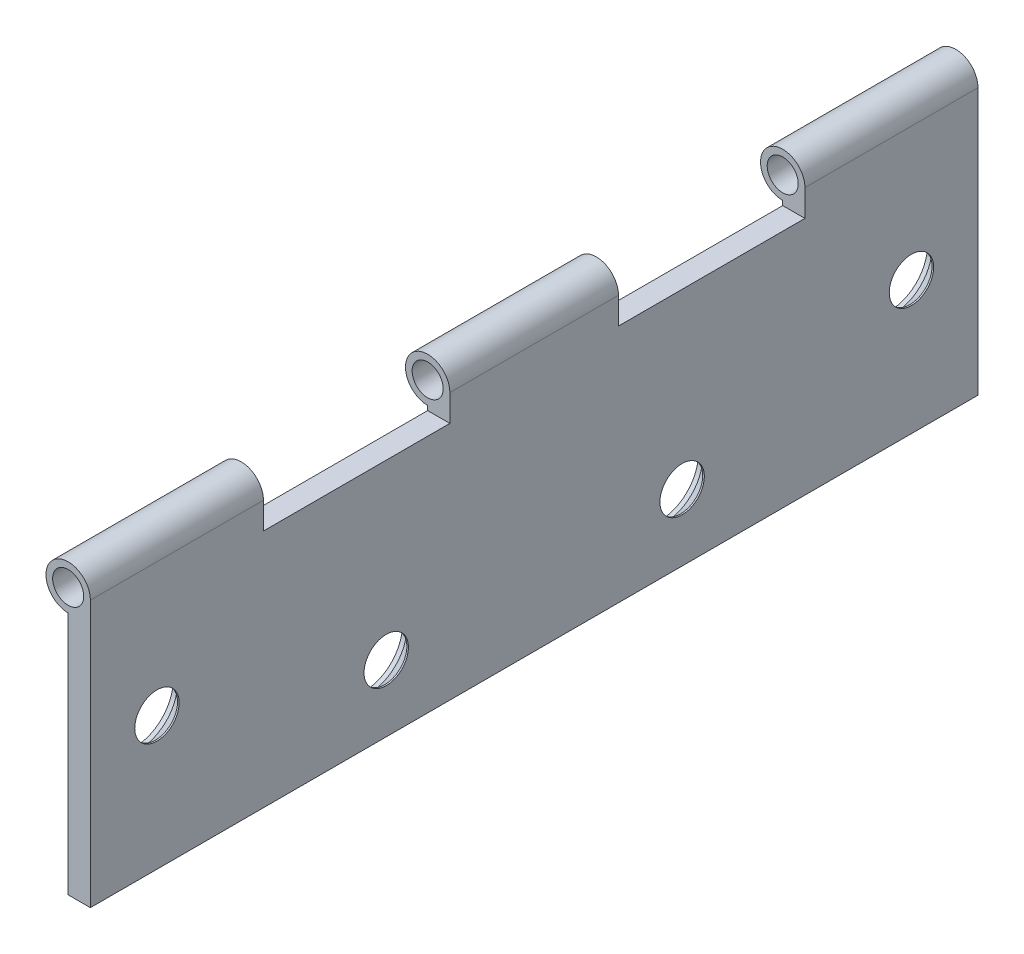
ISO-10303-21;
HEADER;
FILE_DESCRIPTION(('STEP AP214'),'2;1');
FILE_NAME('part.step','',(''),(''),'','','');
FILE_SCHEMA(('AUTOMOTIVE_DESIGN { 1 0 10303 214 1 1 1 1 }'));
ENDSEC;
DATA;
#1=APPLICATION_CONTEXT('core data for automotive mechanical design processes');
#2=APPLICATION_PROTOCOL_DEFINITION('international standard','automotive_design',2000,#1);
#3=PRODUCT_CONTEXT('',#1,'mechanical');
#4=PRODUCT('Part','Part','',(#3));
#5=PRODUCT_RELATED_PRODUCT_CATEGORY('part','',(#4));
#6=PRODUCT_DEFINITION_FORMATION('','',#4);
#7=PRODUCT_DEFINITION_CONTEXT('part definition',#1,'design');
#8=PRODUCT_DEFINITION('design','',#6,#7);
#9=PRODUCT_DEFINITION_SHAPE('','',#8);
#10=(LENGTH_UNIT() NAMED_UNIT(*) SI_UNIT(.MILLI.,.METRE.));
#11=(NAMED_UNIT(*) PLANE_ANGLE_UNIT() SI_UNIT($,.RADIAN.));
#12=(NAMED_UNIT(*) SI_UNIT($,.STERADIAN.) SOLID_ANGLE_UNIT());
#13=UNCERTAINTY_MEASURE_WITH_UNIT(LENGTH_MEASURE(1.E-05),#10,'distance_accuracy_value','');
#14=(GEOMETRIC_REPRESENTATION_CONTEXT(3) GLOBAL_UNCERTAINTY_ASSIGNED_CONTEXT((#13)) GLOBAL_UNIT_ASSIGNED_CONTEXT((#10,
#11,#12)) REPRESENTATION_CONTEXT('',''));
#15=CARTESIAN_POINT('',(0.,0.,0.));
#16=DIRECTION('',(0.,0.,1.));
#17=DIRECTION('',(1.,0.,0.));
#18=AXIS2_PLACEMENT_3D('',#15,#16,#17);
#19=CARTESIAN_POINT('',(-3.33066907387547E-13,60.0000000000005,99.9999999999994));
#20=DIRECTION('',(0.,0.,-1.));
#21=DIRECTION('',(-1.,0.,0.));
#22=AXIS2_PLACEMENT_3D('',#19,#20,#21);
#23=CYLINDRICAL_SURFACE('',#22,5.);
#24=CARTESIAN_POINT('',(-3.33066907387547E-13,60.0000000000007,60.9999999999993));
#25=DIRECTION('',(0.,0.,1.));
#26=DIRECTION('',(1.,0.,0.));
#27=AXIS2_PLACEMENT_3D('',#24,#25,#26);
#28=CIRCLE('',#27,5.);
#29=CARTESIAN_POINT('',(-3.33066907387547E-13,55.0000000000006,60.9999999999993));
#30=VERTEX_POINT('',#29);
#31=CARTESIAN_POINT('',(4.99999999999967,60.0000000000007,60.9999999999993));
#32=VERTEX_POINT('',#31);
#33=EDGE_CURVE('E143',#30,#32,#28,.F.);
#34=ORIENTED_EDGE('',*,*,#33,.F.);
#35=DIRECTION('',(0.,0.,-1.));
#36=VECTOR('',#35,1.);
#37=CARTESIAN_POINT('',(-3.33066907387547E-13,55.0000000000006,99.9999999999994));
#38=LINE('',#37,#36);
#39=CARTESIAN_POINT('',(-3.33066907387547E-13,55.0000000000006,99.9999999999994));
#40=VERTEX_POINT('',#39);
#41=EDGE_CURVE('E231',#30,#40,#38,.F.);
#42=ORIENTED_EDGE('',*,*,#41,.T.);
#43=CARTESIAN_POINT('',(-3.33066907387547E-13,60.0000000000005,99.9999999999994));
#44=DIRECTION('',(0.,0.,-1.));
#45=DIRECTION('',(-1.,0.,0.));
#46=AXIS2_PLACEMENT_3D('',#43,#44,#45);
#47=CIRCLE('',#46,5.);
#48=CARTESIAN_POINT('',(4.99999999999967,60.0000000000005,99.9999999999994));
#49=VERTEX_POINT('',#48);
#50=EDGE_CURVE('E228',#40,#49,#47,.T.);
#51=ORIENTED_EDGE('',*,*,#50,.T.);
#52=DIRECTION('',(0.,0.,-1.));
#53=VECTOR('',#52,1.);
#54=CARTESIAN_POINT('',(4.99999999999967,60.0000000000005,99.9999999999994));
#55=LINE('',#54,#53);
#56=EDGE_CURVE('E117',#49,#32,#55,.T.);
#57=ORIENTED_EDGE('',*,*,#56,.T.);
#58=EDGE_LOOP('',(#34,#42,#51,#57));
#59=FACE_BOUND('',#58,.T.);
#60=ADVANCED_FACE('F48',(#59),#23,.T.);
#61=CARTESIAN_POINT('',(-3.33066907387547E-13,54.9999999999999,-19.0000000000015));
#62=VERTEX_POINT('',#61);
#63=CARTESIAN_POINT('',(-3.33066907387547E-13,55.0000000000006,18.9999999999988));
#64=VERTEX_POINT('',#63);
#65=EDGE_CURVE('E234',#62,#64,#38,.F.);
#66=ORIENTED_EDGE('',*,*,#65,.T.);
#67=CARTESIAN_POINT('',(-3.33066907387547E-13,60.0000000000007,18.9999999999988));
#68=DIRECTION('',(0.,0.,-1.));
#69=DIRECTION('',(-1.,0.,0.));
#70=AXIS2_PLACEMENT_3D('',#67,#68,#69);
#71=CIRCLE('',#70,5.);
#72=CARTESIAN_POINT('',(4.99999999999967,60.0000000000007,18.9999999999988));
#73=VERTEX_POINT('',#72);
#74=EDGE_CURVE('E63',#73,#64,#71,.F.);
#75=ORIENTED_EDGE('',*,*,#74,.F.);
#76=CARTESIAN_POINT('',(4.99999999999967,60.0000000000001,-19.0000000000015));
#77=VERTEX_POINT('',#76);
#78=EDGE_CURVE('E120',#73,#77,#55,.T.);
#79=ORIENTED_EDGE('',*,*,#78,.T.);
#80=CARTESIAN_POINT('',(-3.33066907387547E-13,60.0000000000001,-19.0000000000015));
#81=DIRECTION('',(0.,0.,1.));
#82=DIRECTION('',(1.,0.,0.));
#83=AXIS2_PLACEMENT_3D('',#80,#81,#82);
#84=CIRCLE('',#83,5.);
#85=EDGE_CURVE('E124',#62,#77,#84,.F.);
#86=ORIENTED_EDGE('',*,*,#85,.F.);
#87=EDGE_LOOP('',(#66,#75,#79,#86));
#88=FACE_BOUND('',#87,.T.);
#89=ADVANCED_FACE('F333',(#88),#23,.T.);
#90=CARTESIAN_POINT('',(-3.33066907387547E-13,60.0000000000005,99.9999999999994));
#91=DIRECTION('',(0.,0.,-1.));
#92=DIRECTION('',(-1.,0.,0.));
#93=AXIS2_PLACEMENT_3D('',#90,#91,#92);
#94=CYLINDRICAL_SURFACE('',#93,3.5);
#95=CARTESIAN_POINT('',(-3.33066907387547E-13,60.0000000000007,60.9999999999993));
#96=DIRECTION('',(0.,0.,1.));
#97=DIRECTION('',(1.,0.,0.));
#98=AXIS2_PLACEMENT_3D('',#95,#96,#97);
#99=CIRCLE('',#98,3.5);
#100=CARTESIAN_POINT('',(3.49999999999967,60.0000000000007,60.9999999999993));
#101=VERTEX_POINT('',#100);
#102=EDGE_CURVE('E137',#101,#101,#99,.F.);
#103=ORIENTED_EDGE('',*,*,#102,.T.);
#104=EDGE_LOOP('',(#103));
#105=FACE_BOUND('',#104,.T.);
#106=CARTESIAN_POINT('',(-3.33066907387547E-13,60.0000000000005,99.9999999999994));
#107=DIRECTION('',(0.,0.,-1.));
#108=DIRECTION('',(-1.,0.,0.));
#109=AXIS2_PLACEMENT_3D('',#106,#107,#108);
#110=CIRCLE('',#109,3.5);
#111=CARTESIAN_POINT('',(-3.50000000000033,60.0000000000005,99.9999999999994));
#112=VERTEX_POINT('',#111);
#113=EDGE_CURVE('E223',#112,#112,#110,.T.);
#114=ORIENTED_EDGE('',*,*,#113,.F.);
#115=EDGE_LOOP('',(#114));
#116=FACE_BOUND('',#115,.T.);
#117=ADVANCED_FACE('F346',(#105,#116),#94,.F.);
#118=CARTESIAN_POINT('',(0.,60.0000000000001,-61.0000000000013));
#119=DIRECTION('',(0.,0.,-1.));
#120=DIRECTION('',(-1.,0.,0.));
#121=AXIS2_PLACEMENT_3D('',#118,#119,#120);
#122=CIRCLE('',#121,3.5);
#123=CARTESIAN_POINT('',(-3.5,60.0000000000001,-61.0000000000013));
#124=VERTEX_POINT('',#123);
#125=EDGE_CURVE('E126',#124,#124,#122,.F.);
#126=ORIENTED_EDGE('',*,*,#125,.T.);
#127=EDGE_LOOP('',(#126));
#128=FACE_BOUND('',#127,.T.);
#129=CARTESIAN_POINT('',(0.,60.0000000000001,-100.000000000001));
#130=DIRECTION('',(0.,0.,-1.));
#131=DIRECTION('',(-1.,0.,0.));
#132=AXIS2_PLACEMENT_3D('',#129,#130,#131);
#133=CIRCLE('',#132,3.5);
#134=CARTESIAN_POINT('',(-3.5,60.0000000000001,-100.000000000001));
#135=VERTEX_POINT('',#134);
#136=EDGE_CURVE('E222',#135,#135,#133,.T.);
#137=ORIENTED_EDGE('',*,*,#136,.T.);
#138=EDGE_LOOP('',(#137));
#139=FACE_BOUND('',#138,.T.);
#140=ADVANCED_FACE('F347',(#128,#139),#94,.F.);
#141=CARTESIAN_POINT('',(5.,6.66133814775094E-13,99.9999999999994));
#142=DIRECTION('',(-1.,0.,0.));
#143=DIRECTION('',(0.,0.,1.));
#144=AXIS2_PLACEMENT_3D('',#141,#142,#143);
#145=PLANE('',#144);
#146=DIRECTION('',(0.,0.,1.));
#147=VECTOR('',#146,1.);
#148=CARTESIAN_POINT('',(4.99999999999967,54.0000000000007,18.9999999999988));
#149=LINE('',#148,#147);
#150=CARTESIAN_POINT('',(4.99999999999967,54.0000000000007,18.9999999999988));
#151=VERTEX_POINT('',#150);
#152=CARTESIAN_POINT('',(4.99999999999967,54.0000000000007,60.9999999999993));
#153=VERTEX_POINT('',#152);
#154=EDGE_CURVE('E315',#151,#153,#149,.T.);
#155=ORIENTED_EDGE('',*,*,#154,.T.);
#156=DIRECTION('',(0.,1.,0.));
#157=VECTOR('',#156,1.);
#158=CARTESIAN_POINT('',(4.99999999999967,54.0000000000007,60.9999999999993));
#159=LINE('',#158,#157);
#160=EDGE_CURVE('E322',#153,#32,#159,.T.);
#161=ORIENTED_EDGE('',*,*,#160,.T.);
#162=ORIENTED_EDGE('',*,*,#56,.F.);
#163=DIRECTION('',(0.,1.,0.));
#164=VECTOR('',#163,1.);
#165=CARTESIAN_POINT('',(5.,6.66133814775094E-13,99.9999999999994));
#166=LINE('',#165,#164);
#167=CARTESIAN_POINT('',(5.,6.66133814775094E-13,99.9999999999994));
#168=VERTEX_POINT('',#167);
#169=EDGE_CURVE('E92',#168,#49,#166,.T.);
#170=ORIENTED_EDGE('',*,*,#169,.F.);
#171=DIRECTION('',(0.,0.,-1.));
#172=VECTOR('',#171,1.);
#173=CARTESIAN_POINT('',(5.,6.66133814775094E-13,99.9999999999994));
#174=LINE('',#173,#172);
#175=CARTESIAN_POINT('',(5.,0.,-100.));
#176=VERTEX_POINT('',#175);
#177=EDGE_CURVE('E72',#168,#176,#174,.T.);
#178=ORIENTED_EDGE('',*,*,#177,.T.);
#179=DIRECTION('',(0.,1.,0.));
#180=VECTOR('',#179,1.);
#181=CARTESIAN_POINT('',(5.,0.,-100.));
#182=LINE('',#181,#180);
#183=CARTESIAN_POINT('',(5.,60.0000000000001,-100.000000000001));
#184=VERTEX_POINT('',#183);
#185=EDGE_CURVE('E89',#176,#184,#182,.T.);
#186=ORIENTED_EDGE('',*,*,#185,.T.);
#187=CARTESIAN_POINT('',(5.,60.0000000000001,-61.0000000000013));
#188=VERTEX_POINT('',#187);
#189=EDGE_CURVE('E116',#188,#184,#55,.T.);
#190=ORIENTED_EDGE('',*,*,#189,.F.);
#191=DIRECTION('',(0.,-1.,0.));
#192=VECTOR('',#191,1.);
#193=CARTESIAN_POINT('',(5.,54.,-61.0000000000013));
#194=LINE('',#193,#192);
#195=CARTESIAN_POINT('',(5.,54.,-61.0000000000013));
#196=VERTEX_POINT('',#195);
#197=EDGE_CURVE('E151',#188,#196,#194,.T.);
#198=ORIENTED_EDGE('',*,*,#197,.T.);
#199=DIRECTION('',(0.,0.,1.));
#200=VECTOR('',#199,1.);
#201=CARTESIAN_POINT('',(5.,54.,-61.0000000000013));
#202=LINE('',#201,#200);
#203=CARTESIAN_POINT('',(5.,54.,-19.0000000000015));
#204=VERTEX_POINT('',#203);
#205=EDGE_CURVE('E154',#196,#204,#202,.T.);
#206=ORIENTED_EDGE('',*,*,#205,.T.);
#207=DIRECTION('',(0.,1.,0.));
#208=VECTOR('',#207,1.);
#209=CARTESIAN_POINT('',(5.,54.,-19.0000000000015));
#210=LINE('',#209,#208);
#211=EDGE_CURVE('E157',#204,#77,#210,.T.);
#212=ORIENTED_EDGE('',*,*,#211,.T.);
#213=ORIENTED_EDGE('',*,*,#78,.F.);
#214=DIRECTION('',(0.,-1.,0.));
#215=VECTOR('',#214,1.);
#216=CARTESIAN_POINT('',(4.99999999999967,54.0000000000007,18.9999999999988));
#217=LINE('',#216,#215);
#218=EDGE_CURVE('E312',#73,#151,#217,.T.);
#219=ORIENTED_EDGE('',*,*,#218,.T.);
#220=EDGE_LOOP('',(#155,#161,#162,#170,#178,#186,#190,#198,#206,#212,#213,#219));
#221=FACE_BOUND('',#220,.T.);
#222=CARTESIAN_POINT('',(4.99999999999967,30.0000000000005,84.9999999999993));
#223=DIRECTION('',(-1.,0.,0.));
#224=DIRECTION('',(0.,0.,1.));
#225=AXIS2_PLACEMENT_3D('',#222,#223,#224);
#226=CIRCLE('',#225,5.00000000000002);
#227=CARTESIAN_POINT('',(4.99999999999967,30.0000000000005,89.9999999999993));
#228=VERTEX_POINT('',#227);
#229=EDGE_CURVE('E183',#228,#228,#226,.T.);
#230=ORIENTED_EDGE('',*,*,#229,.T.);
#231=EDGE_LOOP('',(#230));
#232=FACE_BOUND('',#231,.T.);
#233=CARTESIAN_POINT('',(5.,15.0000000000006,33.3333333333332));
#234=DIRECTION('',(-1.,0.,0.));
#235=DIRECTION('',(0.,0.,1.));
#236=AXIS2_PLACEMENT_3D('',#233,#234,#235);
#237=CIRCLE('',#236,5.00000000000001);
#238=CARTESIAN_POINT('',(5.,15.0000000000006,38.3333333333332));
#239=VERTEX_POINT('',#238);
#240=EDGE_CURVE('E195',#239,#239,#237,.T.);
#241=ORIENTED_EDGE('',*,*,#240,.T.);
#242=EDGE_LOOP('',(#241));
#243=FACE_BOUND('',#242,.T.);
#244=CARTESIAN_POINT('',(5.,30.,-85.));
#245=DIRECTION('',(-1.,0.,0.));
#246=DIRECTION('',(0.,0.,1.));
#247=AXIS2_PLACEMENT_3D('',#244,#245,#246);
#248=CIRCLE('',#247,5.00000000000002);
#249=CARTESIAN_POINT('',(5.,30.,-79.9999999999999));
#250=VERTEX_POINT('',#249);
#251=EDGE_CURVE('E207',#250,#250,#248,.T.);
#252=ORIENTED_EDGE('',*,*,#251,.T.);
#253=EDGE_LOOP('',(#252));
#254=FACE_BOUND('',#253,.T.);
#255=CARTESIAN_POINT('',(5.,15.0000000000001,-33.3333333333332));
#256=DIRECTION('',(-1.,0.,0.));
#257=DIRECTION('',(0.,0.,1.));
#258=AXIS2_PLACEMENT_3D('',#255,#256,#257);
#259=CIRCLE('',#258,5.00000000000001);
#260=CARTESIAN_POINT('',(5.,15.0000000000001,-28.3333333333332));
#261=VERTEX_POINT('',#260);
#262=EDGE_CURVE('E219',#261,#261,#259,.T.);
#263=ORIENTED_EDGE('',*,*,#262,.T.);
#264=EDGE_LOOP('',(#263));
#265=FACE_BOUND('',#264,.T.);
#266=ADVANCED_FACE('F50',(#221,#232,#243,#254,#265),#145,.F.);
#267=CARTESIAN_POINT('',(0.,6.66133814775094E-13,99.9999999999994));
#268=DIRECTION('',(-1.,0.,0.));
#269=DIRECTION('',(0.,0.,1.));
#270=AXIS2_PLACEMENT_3D('',#267,#268,#269);
#271=PLANE('',#270);
#272=DIRECTION('',(0.,1.,0.));
#273=VECTOR('',#272,1.);
#274=CARTESIAN_POINT('',(0.,6.66133814775094E-13,60.9999999999993));
#275=LINE('',#274,#273);
#276=CARTESIAN_POINT('',(-3.33066907387547E-13,54.0000000000007,60.9999999999993));
#277=VERTEX_POINT('',#276);
#278=EDGE_CURVE('E139',#277,#30,#275,.T.);
#279=ORIENTED_EDGE('',*,*,#278,.F.);
#280=DIRECTION('',(0.,0.,1.));
#281=VECTOR('',#280,1.);
#282=CARTESIAN_POINT('',(-3.33066907387547E-13,54.0000000000005,99.9999999999994));
#283=LINE('',#282,#281);
#284=CARTESIAN_POINT('',(-3.33066907387547E-13,54.0000000000007,18.9999999999988));
#285=VERTEX_POINT('',#284);
#286=EDGE_CURVE('E13',#285,#277,#283,.T.);
#287=ORIENTED_EDGE('',*,*,#286,.F.);
#288=DIRECTION('',(0.,-1.,0.));
#289=VECTOR('',#288,1.);
#290=CARTESIAN_POINT('',(0.,6.66133814775094E-13,19.0000000000001));
#291=LINE('',#290,#289);
#292=EDGE_CURVE('E135',#64,#285,#291,.T.);
#293=ORIENTED_EDGE('',*,*,#292,.F.);
#294=ORIENTED_EDGE('',*,*,#65,.F.);
#295=DIRECTION('',(0.,1.,0.));
#296=VECTOR('',#295,1.);
#297=CARTESIAN_POINT('',(0.,0.,-19.0000000000001));
#298=LINE('',#297,#296);
#299=CARTESIAN_POINT('',(0.,54.,-19.0000000000015));
#300=VERTEX_POINT('',#299);
#301=EDGE_CURVE('E130',#300,#62,#298,.T.);
#302=ORIENTED_EDGE('',*,*,#301,.F.);
#303=DIRECTION('',(0.,0.,1.));
#304=VECTOR('',#303,1.);
#305=CARTESIAN_POINT('',(-3.33066907387547E-13,54.0000000000007,99.9999999999994));
#306=LINE('',#305,#304);
#307=CARTESIAN_POINT('',(0.,54.,-61.0000000000013));
#308=VERTEX_POINT('',#307);
#309=EDGE_CURVE('E56',#308,#300,#306,.T.);
#310=ORIENTED_EDGE('',*,*,#309,.F.);
#311=DIRECTION('',(0.,-1.,0.));
#312=VECTOR('',#311,1.);
#313=CARTESIAN_POINT('',(0.,0.,-60.9999999999999));
#314=LINE('',#313,#312);
#315=CARTESIAN_POINT('',(0.,55.0000000000002,-61.0000000000013));
#316=VERTEX_POINT('',#315);
#317=EDGE_CURVE('E171',#316,#308,#314,.T.);
#318=ORIENTED_EDGE('',*,*,#317,.F.);
#319=CARTESIAN_POINT('',(0.,55.0000000000002,-100.000000000001));
#320=VERTEX_POINT('',#319);
#321=EDGE_CURVE('E106',#320,#316,#38,.F.);
#322=ORIENTED_EDGE('',*,*,#321,.F.);
#323=DIRECTION('',(0.,1.,0.));
#324=VECTOR('',#323,1.);
#325=CARTESIAN_POINT('',(0.,0.,-100.));
#326=LINE('',#325,#324);
#327=CARTESIAN_POINT('',(0.,0.,-100.));
#328=VERTEX_POINT('',#327);
#329=EDGE_CURVE('E105',#328,#320,#326,.T.);
#330=ORIENTED_EDGE('',*,*,#329,.F.);
#331=DIRECTION('',(0.,0.,-1.));
#332=VECTOR('',#331,1.);
#333=CARTESIAN_POINT('',(0.,6.66133814775094E-13,99.9999999999994));
#334=LINE('',#333,#332);
#335=CARTESIAN_POINT('',(0.,6.66133814775094E-13,99.9999999999994));
#336=VERTEX_POINT('',#335);
#337=EDGE_CURVE('E94',#336,#328,#334,.T.);
#338=ORIENTED_EDGE('',*,*,#337,.F.);
#339=DIRECTION('',(0.,1.,0.));
#340=VECTOR('',#339,1.);
#341=CARTESIAN_POINT('',(0.,6.66133814775094E-13,99.9999999999994));
#342=LINE('',#341,#340);
#343=EDGE_CURVE('E111',#336,#40,#342,.T.);
#344=ORIENTED_EDGE('',*,*,#343,.T.);
#345=ORIENTED_EDGE('',*,*,#41,.F.);
#346=EDGE_LOOP('',(#279,#287,#293,#294,#302,#310,#318,#322,#330,#338,#344,#345));
#347=FACE_BOUND('',#346,.T.);
#348=CARTESIAN_POINT('',(-3.33066907387547E-13,30.0000000000005,84.9999999999993));
#349=DIRECTION('',(-1.,0.,0.));
#350=DIRECTION('',(0.,0.,1.));
#351=AXIS2_PLACEMENT_3D('',#348,#349,#350);
#352=CIRCLE('',#351,8.65);
#353=CARTESIAN_POINT('',(-3.36128000433256E-13,30.0000000000005,93.6499999999993));
#354=VERTEX_POINT('',#353);
#355=EDGE_CURVE('E174',#354,#354,#352,.T.);
#356=ORIENTED_EDGE('',*,*,#355,.F.);
#357=EDGE_LOOP('',(#356));
#358=FACE_BOUND('',#357,.T.);
#359=CARTESIAN_POINT('',(0.,15.0000000000006,33.3333333333332));
#360=DIRECTION('',(-1.,0.,0.));
#361=DIRECTION('',(0.,0.,1.));
#362=AXIS2_PLACEMENT_3D('',#359,#360,#361);
#363=CIRCLE('',#362,8.65);
#364=CARTESIAN_POINT('',(0.,15.0000000000006,41.9833333333332));
#365=VERTEX_POINT('',#364);
#366=EDGE_CURVE('E186',#365,#365,#363,.T.);
#367=ORIENTED_EDGE('',*,*,#366,.F.);
#368=EDGE_LOOP('',(#367));
#369=FACE_BOUND('',#368,.T.);
#370=CARTESIAN_POINT('',(0.,30.,-85.));
#371=DIRECTION('',(-1.,0.,0.));
#372=DIRECTION('',(0.,0.,1.));
#373=AXIS2_PLACEMENT_3D('',#370,#371,#372);
#374=CIRCLE('',#373,8.65);
#375=CARTESIAN_POINT('',(0.,30.,-76.35));
#376=VERTEX_POINT('',#375);
#377=EDGE_CURVE('E198',#376,#376,#374,.T.);
#378=ORIENTED_EDGE('',*,*,#377,.F.);
#379=EDGE_LOOP('',(#378));
#380=FACE_BOUND('',#379,.T.);
#381=CARTESIAN_POINT('',(0.,15.0000000000001,-33.3333333333332));
#382=DIRECTION('',(-1.,0.,0.));
#383=DIRECTION('',(0.,0.,1.));
#384=AXIS2_PLACEMENT_3D('',#381,#382,#383);
#385=CIRCLE('',#384,8.65);
#386=CARTESIAN_POINT('',(0.,15.0000000000001,-24.6833333333332));
#387=VERTEX_POINT('',#386);
#388=EDGE_CURVE('E210',#387,#387,#385,.T.);
#389=ORIENTED_EDGE('',*,*,#388,.F.);
#390=EDGE_LOOP('',(#389));
#391=FACE_BOUND('',#390,.T.);
#392=ADVANCED_FACE('F247',(#347,#358,#369,#380,#391),#271,.T.);
#393=CARTESIAN_POINT('',(5.,6.66133814775094E-13,99.9999999999994));
#394=DIRECTION('',(0.,-1.,0.));
#395=DIRECTION('',(0.,0.,-1.));
#396=AXIS2_PLACEMENT_3D('',#393,#394,#395);
#397=PLANE('',#396);
#398=DIRECTION('',(-1.,0.,0.));
#399=VECTOR('',#398,1.);
#400=CARTESIAN_POINT('',(5.,0.,-100.));
#401=LINE('',#400,#399);
#402=EDGE_CURVE('E102',#176,#328,#401,.T.);
#403=ORIENTED_EDGE('',*,*,#402,.F.);
#404=ORIENTED_EDGE('',*,*,#177,.F.);
#405=DIRECTION('',(-1.,0.,0.));
#406=VECTOR('',#405,1.);
#407=CARTESIAN_POINT('',(5.,6.66133814775094E-13,99.9999999999994));
#408=LINE('',#407,#406);
#409=EDGE_CURVE('E95',#168,#336,#408,.T.);
#410=ORIENTED_EDGE('',*,*,#409,.T.);
#411=ORIENTED_EDGE('',*,*,#337,.T.);
#412=EDGE_LOOP('',(#403,#404,#410,#411));
#413=FACE_BOUND('',#412,.T.);
#414=ADVANCED_FACE('F108',(#413),#397,.T.);
#415=CARTESIAN_POINT('',(0.,6.66133814775094E-13,99.9999999999994));
#416=DIRECTION('',(0.,0.,-1.));
#417=DIRECTION('',(-1.,0.,0.));
#418=AXIS2_PLACEMENT_3D('',#415,#416,#417);
#419=PLANE('',#418);
#420=ORIENTED_EDGE('',*,*,#113,.T.);
#421=EDGE_LOOP('',(#420));
#422=FACE_BOUND('',#421,.T.);
#423=ORIENTED_EDGE('',*,*,#169,.T.);
#424=ORIENTED_EDGE('',*,*,#50,.F.);
#425=ORIENTED_EDGE('',*,*,#343,.F.);
#426=ORIENTED_EDGE('',*,*,#409,.F.);
#427=EDGE_LOOP('',(#423,#424,#425,#426));
#428=FACE_BOUND('',#427,.T.);
#429=ADVANCED_FACE('F240',(#422,#428),#419,.F.);
#430=CARTESIAN_POINT('',(0.,0.,-100.));
#431=DIRECTION('',(0.,0.,-1.));
#432=DIRECTION('',(-1.,0.,0.));
#433=AXIS2_PLACEMENT_3D('',#430,#431,#432);
#434=PLANE('',#433);
#435=ORIENTED_EDGE('',*,*,#136,.F.);
#436=EDGE_LOOP('',(#435));
#437=FACE_BOUND('',#436,.T.);
#438=CARTESIAN_POINT('',(0.,60.0000000000001,-100.000000000001));
#439=DIRECTION('',(0.,0.,-1.));
#440=DIRECTION('',(-1.,0.,0.));
#441=AXIS2_PLACEMENT_3D('',#438,#439,#440);
#442=CIRCLE('',#441,5.);
#443=EDGE_CURVE('E104',#320,#184,#442,.T.);
#444=ORIENTED_EDGE('',*,*,#443,.T.);
#445=ORIENTED_EDGE('',*,*,#185,.F.);
#446=ORIENTED_EDGE('',*,*,#402,.T.);
#447=ORIENTED_EDGE('',*,*,#329,.T.);
#448=EDGE_LOOP('',(#444,#445,#446,#447));
#449=FACE_BOUND('',#448,.T.);
#450=ADVANCED_FACE('F100',(#437,#449),#434,.T.);
#451=CARTESIAN_POINT('',(0.,60.0000000000001,-61.0000000000013));
#452=DIRECTION('',(0.,0.,-1.));
#453=DIRECTION('',(-1.,0.,0.));
#454=AXIS2_PLACEMENT_3D('',#451,#452,#453);
#455=CIRCLE('',#454,5.);
#456=EDGE_CURVE('E129',#188,#316,#455,.F.);
#457=ORIENTED_EDGE('',*,*,#456,.F.);
#458=ORIENTED_EDGE('',*,*,#189,.T.);
#459=ORIENTED_EDGE('',*,*,#443,.F.);
#460=ORIENTED_EDGE('',*,*,#321,.T.);
#461=EDGE_LOOP('',(#457,#458,#459,#460));
#462=FACE_BOUND('',#461,.T.);
#463=ADVANCED_FACE('F262',(#462),#23,.T.);
#464=CARTESIAN_POINT('',(-3.33066907387547E-13,60.0000000000007,18.9999999999988));
#465=DIRECTION('',(0.,0.,-1.));
#466=DIRECTION('',(-1.,0.,0.));
#467=AXIS2_PLACEMENT_3D('',#464,#465,#466);
#468=CIRCLE('',#467,3.5);
#469=CARTESIAN_POINT('',(-3.50000000000033,60.0000000000007,18.9999999999988));
#470=VERTEX_POINT('',#469);
#471=EDGE_CURVE('E133',#470,#470,#468,.F.);
#472=ORIENTED_EDGE('',*,*,#471,.T.);
#473=EDGE_LOOP('',(#472));
#474=FACE_BOUND('',#473,.T.);
#475=CARTESIAN_POINT('',(-3.33066907387547E-13,60.0000000000001,-19.0000000000015));
#476=DIRECTION('',(0.,0.,1.));
#477=DIRECTION('',(1.,0.,0.));
#478=AXIS2_PLACEMENT_3D('',#475,#476,#477);
#479=CIRCLE('',#478,3.5);
#480=CARTESIAN_POINT('',(3.49999999999967,60.0000000000001,-19.0000000000015));
#481=VERTEX_POINT('',#480);
#482=EDGE_CURVE('E121',#481,#481,#479,.F.);
#483=ORIENTED_EDGE('',*,*,#482,.T.);
#484=EDGE_LOOP('',(#483));
#485=FACE_BOUND('',#484,.T.);
#486=ADVANCED_FACE('F341',(#474,#485),#94,.F.);
#487=CARTESIAN_POINT('',(0.,15.0000000000001,-33.3333333333332));
#488=DIRECTION('',(-1.,0.,0.));
#489=DIRECTION('',(0.,0.,1.));
#490=AXIS2_PLACEMENT_3D('',#487,#488,#489);
#491=CYLINDRICAL_SURFACE('',#490,5.);
#492=ORIENTED_EDGE('',*,*,#262,.F.);
#493=EDGE_LOOP('',(#492));
#494=FACE_BOUND('',#493,.T.);
#495=CARTESIAN_POINT('',(4.65000000000004,15.0000000000001,-33.3333333333332));
#496=DIRECTION('',(-1.,0.,0.));
#497=DIRECTION('',(0.,0.,1.));
#498=AXIS2_PLACEMENT_3D('',#495,#496,#497);
#499=CIRCLE('',#498,5.);
#500=CARTESIAN_POINT('',(4.65000000000004,15.0000000000001,-28.3333333333332));
#501=VERTEX_POINT('',#500);
#502=EDGE_CURVE('E216',#501,#501,#499,.T.);
#503=ORIENTED_EDGE('',*,*,#502,.T.);
#504=EDGE_LOOP('',(#503));
#505=FACE_BOUND('',#504,.T.);
#506=ADVANCED_FACE('F343',(#494,#505),#491,.F.);
#507=CARTESIAN_POINT('',(1.,15.0000000000001,-33.3333333333332));
#508=DIRECTION('',(-1.,0.,0.));
#509=DIRECTION('',(0.,0.,1.));
#510=AXIS2_PLACEMENT_3D('',#507,#508,#509);
#511=CONICAL_SURFACE('',#510,8.65,0.785398163397449);
#512=ORIENTED_EDGE('',*,*,#502,.F.);
#513=EDGE_LOOP('',(#512));
#514=FACE_BOUND('',#513,.T.);
#515=CARTESIAN_POINT('',(1.,15.0000000000001,-33.3333333333332));
#516=DIRECTION('',(-1.,0.,0.));
#517=DIRECTION('',(0.,0.,1.));
#518=AXIS2_PLACEMENT_3D('',#515,#516,#517);
#519=CIRCLE('',#518,8.65);
#520=CARTESIAN_POINT('',(0.999999999999998,15.0000000000001,-24.6833333333332));
#521=VERTEX_POINT('',#520);
#522=EDGE_CURVE('E213',#521,#521,#519,.T.);
#523=ORIENTED_EDGE('',*,*,#522,.T.);
#524=EDGE_LOOP('',(#523));
#525=FACE_BOUND('',#524,.T.);
#526=ADVANCED_FACE('F352',(#514,#525),#511,.F.);
#527=CARTESIAN_POINT('',(0.,15.0000000000001,-33.3333333333332));
#528=DIRECTION('',(-1.,0.,0.));
#529=DIRECTION('',(0.,0.,1.));
#530=AXIS2_PLACEMENT_3D('',#527,#528,#529);
#531=CYLINDRICAL_SURFACE('',#530,8.65);
#532=ORIENTED_EDGE('',*,*,#522,.F.);
#533=EDGE_LOOP('',(#532));
#534=FACE_BOUND('',#533,.T.);
#535=ORIENTED_EDGE('',*,*,#388,.T.);
#536=EDGE_LOOP('',(#535));
#537=FACE_BOUND('',#536,.T.);
#538=ADVANCED_FACE('F465',(#534,#537),#531,.F.);
#539=CARTESIAN_POINT('',(0.,30.,-85.));
#540=DIRECTION('',(-1.,0.,0.));
#541=DIRECTION('',(0.,0.,1.));
#542=AXIS2_PLACEMENT_3D('',#539,#540,#541);
#543=CYLINDRICAL_SURFACE('',#542,5.00000000000001);
#544=ORIENTED_EDGE('',*,*,#251,.F.);
#545=EDGE_LOOP('',(#544));
#546=FACE_BOUND('',#545,.T.);
#547=CARTESIAN_POINT('',(4.65000000000004,30.,-85.));
#548=DIRECTION('',(-1.,0.,0.));
#549=DIRECTION('',(0.,0.,1.));
#550=AXIS2_PLACEMENT_3D('',#547,#548,#549);
#551=CIRCLE('',#550,5.);
#552=CARTESIAN_POINT('',(4.65000000000004,30.,-80.));
#553=VERTEX_POINT('',#552);
#554=EDGE_CURVE('E204',#553,#553,#551,.T.);
#555=ORIENTED_EDGE('',*,*,#554,.T.);
#556=EDGE_LOOP('',(#555));
#557=FACE_BOUND('',#556,.T.);
#558=ADVANCED_FACE('F461',(#546,#557),#543,.F.);
#559=CARTESIAN_POINT('',(1.,30.,-85.));
#560=DIRECTION('',(-1.,0.,0.));
#561=DIRECTION('',(0.,0.,1.));
#562=AXIS2_PLACEMENT_3D('',#559,#560,#561);
#563=CONICAL_SURFACE('',#562,8.65,0.785398163397449);
#564=ORIENTED_EDGE('',*,*,#554,.F.);
#565=EDGE_LOOP('',(#564));
#566=FACE_BOUND('',#565,.T.);
#567=CARTESIAN_POINT('',(1.,30.,-85.));
#568=DIRECTION('',(-1.,0.,0.));
#569=DIRECTION('',(0.,0.,1.));
#570=AXIS2_PLACEMENT_3D('',#567,#568,#569);
#571=CIRCLE('',#570,8.65);
#572=CARTESIAN_POINT('',(0.999999999999998,30.,-76.35));
#573=VERTEX_POINT('',#572);
#574=EDGE_CURVE('E201',#573,#573,#571,.T.);
#575=ORIENTED_EDGE('',*,*,#574,.T.);
#576=EDGE_LOOP('',(#575));
#577=FACE_BOUND('',#576,.T.);
#578=ADVANCED_FACE('F457',(#566,#577),#563,.F.);
#579=CARTESIAN_POINT('',(0.,30.,-85.));
#580=DIRECTION('',(-1.,0.,0.));
#581=DIRECTION('',(0.,0.,1.));
#582=AXIS2_PLACEMENT_3D('',#579,#580,#581);
#583=CYLINDRICAL_SURFACE('',#582,8.65);
#584=ORIENTED_EDGE('',*,*,#574,.F.);
#585=EDGE_LOOP('',(#584));
#586=FACE_BOUND('',#585,.T.);
#587=ORIENTED_EDGE('',*,*,#377,.T.);
#588=EDGE_LOOP('',(#587));
#589=FACE_BOUND('',#588,.T.);
#590=ADVANCED_FACE('F453',(#586,#589),#583,.F.);
#591=CARTESIAN_POINT('',(0.,15.0000000000006,33.3333333333332));
#592=DIRECTION('',(-1.,0.,0.));
#593=DIRECTION('',(0.,0.,1.));
#594=AXIS2_PLACEMENT_3D('',#591,#592,#593);
#595=CYLINDRICAL_SURFACE('',#594,5.);
#596=ORIENTED_EDGE('',*,*,#240,.F.);
#597=EDGE_LOOP('',(#596));
#598=FACE_BOUND('',#597,.T.);
#599=CARTESIAN_POINT('',(4.65000000000004,15.0000000000006,33.3333333333332));
#600=DIRECTION('',(-1.,0.,0.));
#601=DIRECTION('',(0.,0.,1.));
#602=AXIS2_PLACEMENT_3D('',#599,#600,#601);
#603=CIRCLE('',#602,5.);
#604=CARTESIAN_POINT('',(4.65000000000004,15.0000000000006,38.3333333333332));
#605=VERTEX_POINT('',#604);
#606=EDGE_CURVE('E192',#605,#605,#603,.T.);
#607=ORIENTED_EDGE('',*,*,#606,.T.);
#608=EDGE_LOOP('',(#607));
#609=FACE_BOUND('',#608,.T.);
#610=ADVANCED_FACE('F449',(#598,#609),#595,.F.);
#611=CARTESIAN_POINT('',(1.,15.0000000000006,33.3333333333332));
#612=DIRECTION('',(-1.,0.,0.));
#613=DIRECTION('',(0.,0.,1.));
#614=AXIS2_PLACEMENT_3D('',#611,#612,#613);
#615=CONICAL_SURFACE('',#614,8.65,0.785398163397449);
#616=ORIENTED_EDGE('',*,*,#606,.F.);
#617=EDGE_LOOP('',(#616));
#618=FACE_BOUND('',#617,.T.);
#619=CARTESIAN_POINT('',(1.,15.0000000000006,33.3333333333332));
#620=DIRECTION('',(-1.,0.,0.));
#621=DIRECTION('',(0.,0.,1.));
#622=AXIS2_PLACEMENT_3D('',#619,#620,#621);
#623=CIRCLE('',#622,8.65);
#624=CARTESIAN_POINT('',(0.999999999999998,15.0000000000006,41.9833333333332));
#625=VERTEX_POINT('',#624);
#626=EDGE_CURVE('E189',#625,#625,#623,.T.);
#627=ORIENTED_EDGE('',*,*,#626,.T.);
#628=EDGE_LOOP('',(#627));
#629=FACE_BOUND('',#628,.T.);
#630=ADVANCED_FACE('F445',(#618,#629),#615,.F.);
#631=CARTESIAN_POINT('',(0.,15.0000000000006,33.3333333333332));
#632=DIRECTION('',(-1.,0.,0.));
#633=DIRECTION('',(0.,0.,1.));
#634=AXIS2_PLACEMENT_3D('',#631,#632,#633);
#635=CYLINDRICAL_SURFACE('',#634,8.65);
#636=ORIENTED_EDGE('',*,*,#626,.F.);
#637=EDGE_LOOP('',(#636));
#638=FACE_BOUND('',#637,.T.);
#639=ORIENTED_EDGE('',*,*,#366,.T.);
#640=EDGE_LOOP('',(#639));
#641=FACE_BOUND('',#640,.T.);
#642=ADVANCED_FACE('F441',(#638,#641),#635,.F.);
#643=CARTESIAN_POINT('',(-3.33066907387547E-13,30.0000000000005,84.9999999999993));
#644=DIRECTION('',(-1.,0.,0.));
#645=DIRECTION('',(0.,0.,1.));
#646=AXIS2_PLACEMENT_3D('',#643,#644,#645);
#647=CYLINDRICAL_SURFACE('',#646,5.00000000000001);
#648=ORIENTED_EDGE('',*,*,#229,.F.);
#649=EDGE_LOOP('',(#648));
#650=FACE_BOUND('',#649,.T.);
#651=CARTESIAN_POINT('',(4.64999999999971,30.0000000000005,84.9999999999993));
#652=DIRECTION('',(-1.,0.,0.));
#653=DIRECTION('',(0.,0.,1.));
#654=AXIS2_PLACEMENT_3D('',#651,#652,#653);
#655=CIRCLE('',#654,5.);
#656=CARTESIAN_POINT('',(4.64999999999971,30.0000000000005,89.9999999999993));
#657=VERTEX_POINT('',#656);
#658=EDGE_CURVE('E180',#657,#657,#655,.T.);
#659=ORIENTED_EDGE('',*,*,#658,.T.);
#660=EDGE_LOOP('',(#659));
#661=FACE_BOUND('',#660,.T.);
#662=ADVANCED_FACE('F437',(#650,#661),#647,.F.);
#663=CARTESIAN_POINT('',(0.999999999999668,30.0000000000005,84.9999999999993));
#664=DIRECTION('',(-1.,0.,0.));
#665=DIRECTION('',(0.,0.,1.));
#666=AXIS2_PLACEMENT_3D('',#663,#664,#665);
#667=CONICAL_SURFACE('',#666,8.65,0.785398163397449);
#668=ORIENTED_EDGE('',*,*,#658,.F.);
#669=EDGE_LOOP('',(#668));
#670=FACE_BOUND('',#669,.T.);
#671=CARTESIAN_POINT('',(0.999999999999668,30.0000000000005,84.9999999999993));
#672=DIRECTION('',(-1.,0.,0.));
#673=DIRECTION('',(0.,0.,1.));
#674=AXIS2_PLACEMENT_3D('',#671,#672,#673);
#675=CIRCLE('',#674,8.65);
#676=CARTESIAN_POINT('',(0.999999999999665,30.0000000000005,93.6499999999993));
#677=VERTEX_POINT('',#676);
#678=EDGE_CURVE('E177',#677,#677,#675,.T.);
#679=ORIENTED_EDGE('',*,*,#678,.T.);
#680=EDGE_LOOP('',(#679));
#681=FACE_BOUND('',#680,.T.);
#682=ADVANCED_FACE('F433',(#670,#681),#667,.F.);
#683=CARTESIAN_POINT('',(-3.33066907387547E-13,30.0000000000005,84.9999999999993));
#684=DIRECTION('',(-1.,0.,0.));
#685=DIRECTION('',(0.,0.,1.));
#686=AXIS2_PLACEMENT_3D('',#683,#684,#685);
#687=CYLINDRICAL_SURFACE('',#686,8.65);
#688=ORIENTED_EDGE('',*,*,#678,.F.);
#689=EDGE_LOOP('',(#688));
#690=FACE_BOUND('',#689,.T.);
#691=ORIENTED_EDGE('',*,*,#355,.T.);
#692=EDGE_LOOP('',(#691));
#693=FACE_BOUND('',#692,.T.);
#694=ADVANCED_FACE('F400',(#690,#693),#687,.F.);
#695=CARTESIAN_POINT('',(5.,54.,-61.0000000000013));
#696=DIRECTION('',(0.,0.,-1.));
#697=DIRECTION('',(-1.,0.,0.));
#698=AXIS2_PLACEMENT_3D('',#695,#696,#697);
#699=PLANE('',#698);
#700=ORIENTED_EDGE('',*,*,#317,.T.);
#701=DIRECTION('',(-1.,0.,0.));
#702=VECTOR('',#701,1.);
#703=CARTESIAN_POINT('',(5.,54.,-61.0000000000013));
#704=LINE('',#703,#702);
#705=EDGE_CURVE('E160',#196,#308,#704,.T.);
#706=ORIENTED_EDGE('',*,*,#705,.F.);
#707=ORIENTED_EDGE('',*,*,#197,.F.);
#708=ORIENTED_EDGE('',*,*,#456,.T.);
#709=EDGE_LOOP('',(#700,#706,#707,#708));
#710=FACE_BOUND('',#709,.T.);
#711=ORIENTED_EDGE('',*,*,#125,.F.);
#712=EDGE_LOOP('',(#711));
#713=FACE_BOUND('',#712,.T.);
#714=ADVANCED_FACE('F270',(#710,#713),#699,.F.);
#715=CARTESIAN_POINT('',(5.,54.,-19.0000000000015));
#716=DIRECTION('',(0.,0.,1.));
#717=DIRECTION('',(1.,0.,0.));
#718=AXIS2_PLACEMENT_3D('',#715,#716,#717);
#719=PLANE('',#718);
#720=ORIENTED_EDGE('',*,*,#301,.T.);
#721=ORIENTED_EDGE('',*,*,#85,.T.);
#722=ORIENTED_EDGE('',*,*,#211,.F.);
#723=DIRECTION('',(-1.,0.,0.));
#724=VECTOR('',#723,1.);
#725=CARTESIAN_POINT('',(5.,54.,-19.0000000000015));
#726=LINE('',#725,#724);
#727=EDGE_CURVE('E125',#204,#300,#726,.T.);
#728=ORIENTED_EDGE('',*,*,#727,.T.);
#729=EDGE_LOOP('',(#720,#721,#722,#728));
#730=FACE_BOUND('',#729,.T.);
#731=ORIENTED_EDGE('',*,*,#482,.F.);
#732=EDGE_LOOP('',(#731));
#733=FACE_BOUND('',#732,.T.);
#734=ADVANCED_FACE('F335',(#730,#733),#719,.F.);
#735=CARTESIAN_POINT('',(5.,54.,-61.0000000000013));
#736=DIRECTION('',(0.,-1.,0.));
#737=DIRECTION('',(0.,0.,-1.));
#738=AXIS2_PLACEMENT_3D('',#735,#736,#737);
#739=PLANE('',#738);
#740=ORIENTED_EDGE('',*,*,#309,.T.);
#741=ORIENTED_EDGE('',*,*,#727,.F.);
#742=ORIENTED_EDGE('',*,*,#205,.F.);
#743=ORIENTED_EDGE('',*,*,#705,.T.);
#744=EDGE_LOOP('',(#740,#741,#742,#743));
#745=FACE_BOUND('',#744,.T.);
#746=ADVANCED_FACE('F278',(#745),#739,.F.);
#747=CARTESIAN_POINT('',(4.99999999999967,54.0000000000007,60.9999999999993));
#748=DIRECTION('',(0.,0.,1.));
#749=DIRECTION('',(1.,0.,0.));
#750=AXIS2_PLACEMENT_3D('',#747,#748,#749);
#751=PLANE('',#750);
#752=ORIENTED_EDGE('',*,*,#33,.T.);
#753=ORIENTED_EDGE('',*,*,#160,.F.);
#754=DIRECTION('',(-1.,0.,0.));
#755=VECTOR('',#754,1.);
#756=CARTESIAN_POINT('',(4.99999999999967,54.0000000000007,60.9999999999993));
#757=LINE('',#756,#755);
#758=EDGE_CURVE('E136',#153,#277,#757,.T.);
#759=ORIENTED_EDGE('',*,*,#758,.T.);
#760=ORIENTED_EDGE('',*,*,#278,.T.);
#761=EDGE_LOOP('',(#752,#753,#759,#760));
#762=FACE_BOUND('',#761,.T.);
#763=ORIENTED_EDGE('',*,*,#102,.F.);
#764=EDGE_LOOP('',(#763));
#765=FACE_BOUND('',#764,.T.);
#766=ADVANCED_FACE('F327',(#762,#765),#751,.F.);
#767=CARTESIAN_POINT('',(4.99999999999967,54.0000000000007,18.9999999999988));
#768=DIRECTION('',(0.,0.,-1.));
#769=DIRECTION('',(-1.,0.,0.));
#770=AXIS2_PLACEMENT_3D('',#767,#768,#769);
#771=PLANE('',#770);
#772=ORIENTED_EDGE('',*,*,#74,.T.);
#773=ORIENTED_EDGE('',*,*,#292,.T.);
#774=DIRECTION('',(-1.,0.,0.));
#775=VECTOR('',#774,1.);
#776=CARTESIAN_POINT('',(4.99999999999967,54.0000000000007,18.9999999999988));
#777=LINE('',#776,#775);
#778=EDGE_CURVE('E307',#151,#285,#777,.T.);
#779=ORIENTED_EDGE('',*,*,#778,.F.);
#780=ORIENTED_EDGE('',*,*,#218,.F.);
#781=EDGE_LOOP('',(#772,#773,#779,#780));
#782=FACE_BOUND('',#781,.T.);
#783=ORIENTED_EDGE('',*,*,#471,.F.);
#784=EDGE_LOOP('',(#783));
#785=FACE_BOUND('',#784,.T.);
#786=ADVANCED_FACE('F309',(#782,#785),#771,.F.);
#787=CARTESIAN_POINT('',(4.99999999999967,54.0000000000007,18.9999999999988));
#788=DIRECTION('',(0.,-1.,0.));
#789=DIRECTION('',(0.,0.,-1.));
#790=AXIS2_PLACEMENT_3D('',#787,#788,#789);
#791=PLANE('',#790);
#792=ORIENTED_EDGE('',*,*,#286,.T.);
#793=ORIENTED_EDGE('',*,*,#758,.F.);
#794=ORIENTED_EDGE('',*,*,#154,.F.);
#795=ORIENTED_EDGE('',*,*,#778,.T.);
#796=EDGE_LOOP('',(#792,#793,#794,#795));
#797=FACE_BOUND('',#796,.T.);
#798=ADVANCED_FACE('F316',(#797),#791,.F.);
#799=CLOSED_SHELL('',(#60,#89,#117,#140,#266,#392,#414,#429,#450,#463,#486,#506,#526,#538,#558,
#578,#590,#610,#630,#642,#662,#682,#694,#714,#734,#746,#766,#786,#798));
#800=MANIFOLD_SOLID_BREP('B2',#799);
#801=ADVANCED_BREP_SHAPE_REPRESENTATION('',(#18,#800),#14);
#802=SHAPE_DEFINITION_REPRESENTATION(#9,#801);
ENDSEC;
END-ISO-10303-21;
